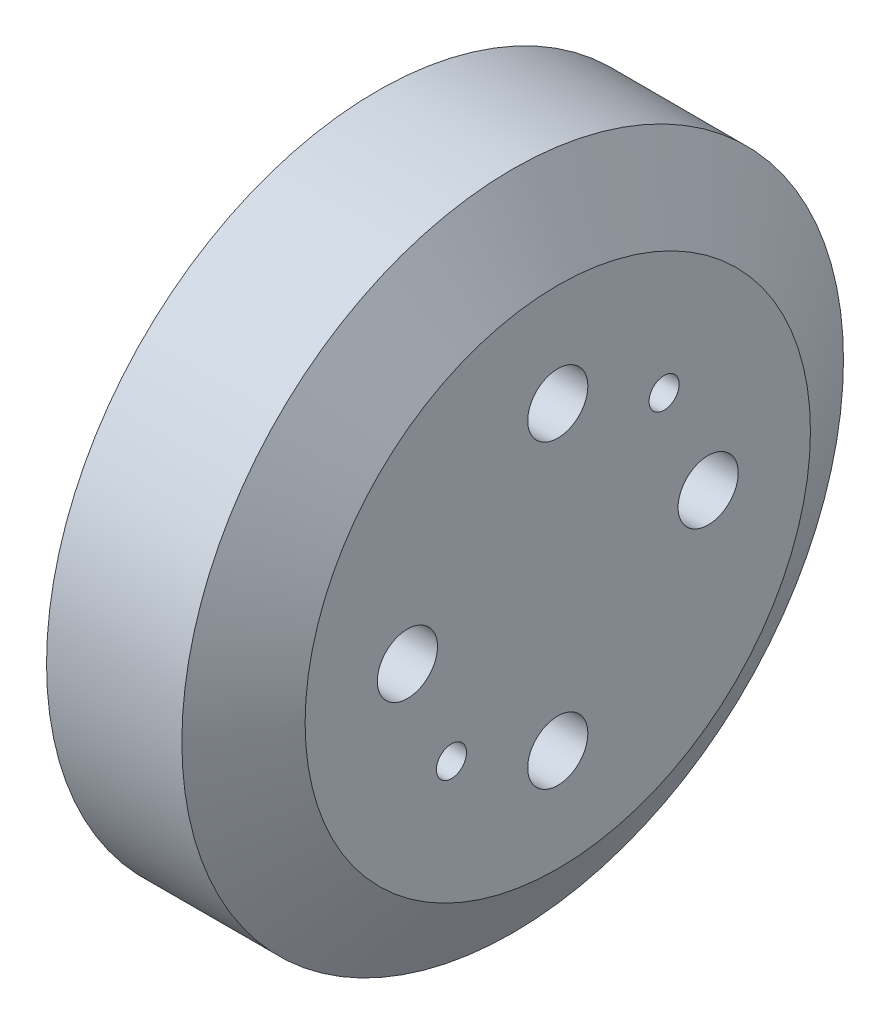
ISO-10303-21;
HEADER;
FILE_DESCRIPTION(('STEP AP214'),'2;1');
FILE_NAME('part.step','',(''),(''),'','','');
FILE_SCHEMA(('AUTOMOTIVE_DESIGN { 1 0 10303 214 1 1 1 1 }'));
ENDSEC;
DATA;
#1=APPLICATION_CONTEXT('core data for automotive mechanical design processes');
#2=APPLICATION_PROTOCOL_DEFINITION('international standard','automotive_design',2000,#1);
#3=PRODUCT_CONTEXT('',#1,'mechanical');
#4=PRODUCT('Part','Part','',(#3));
#5=PRODUCT_RELATED_PRODUCT_CATEGORY('part','',(#4));
#6=PRODUCT_DEFINITION_FORMATION('','',#4);
#7=PRODUCT_DEFINITION_CONTEXT('part definition',#1,'design');
#8=PRODUCT_DEFINITION('design','',#6,#7);
#9=PRODUCT_DEFINITION_SHAPE('','',#8);
#10=(LENGTH_UNIT() NAMED_UNIT(*) SI_UNIT(.MILLI.,.METRE.));
#11=(NAMED_UNIT(*) PLANE_ANGLE_UNIT() SI_UNIT($,.RADIAN.));
#12=(NAMED_UNIT(*) SI_UNIT($,.STERADIAN.) SOLID_ANGLE_UNIT());
#13=UNCERTAINTY_MEASURE_WITH_UNIT(LENGTH_MEASURE(1.E-05),#10,'distance_accuracy_value','');
#14=(GEOMETRIC_REPRESENTATION_CONTEXT(3) GLOBAL_UNCERTAINTY_ASSIGNED_CONTEXT((#13)) GLOBAL_UNIT_ASSIGNED_CONTEXT((#10,
#11,#12)) REPRESENTATION_CONTEXT('',''));
#15=CARTESIAN_POINT('',(0.,0.,0.));
#16=DIRECTION('',(0.,0.,1.));
#17=DIRECTION('',(1.,0.,0.));
#18=AXIS2_PLACEMENT_3D('',#15,#16,#17);
#19=CARTESIAN_POINT('',(0.,0.,0.));
#20=DIRECTION('',(1.,0.,0.));
#21=DIRECTION('',(0.,0.,-1.));
#22=AXIS2_PLACEMENT_3D('',#19,#20,#21);
#23=PLANE('',#22);
#24=CARTESIAN_POINT('',(0.,0.,0.));
#25=DIRECTION('',(1.,0.,0.));
#26=DIRECTION('',(0.,0.,-1.));
#27=AXIS2_PLACEMENT_3D('',#24,#25,#26);
#28=CIRCLE('',#27,110.);
#29=CARTESIAN_POINT('',(0.,0.,110.));
#30=VERTEX_POINT('',#29);
#31=EDGE_CURVE('E48',#30,#30,#28,.T.);
#32=ORIENTED_EDGE('',*,*,#31,.F.);
#33=EDGE_LOOP('',(#32));
#34=FACE_BOUND('',#33,.T.);
#35=CARTESIAN_POINT('',(0.,0.,0.));
#36=DIRECTION('',(1.,0.,0.));
#37=DIRECTION('',(0.,0.,-1.));
#38=AXIS2_PLACEMENT_3D('',#35,#36,#37);
#39=CIRCLE('',#38,100.);
#40=CARTESIAN_POINT('',(0.,0.,100.));
#41=VERTEX_POINT('',#40);
#42=EDGE_CURVE('E53',#41,#41,#39,.T.);
#43=ORIENTED_EDGE('',*,*,#42,.T.);
#44=EDGE_LOOP('',(#43));
#45=FACE_BOUND('',#44,.T.);
#46=ADVANCED_FACE('F37',(#34,#45),#23,.F.);
#47=CARTESIAN_POINT('',(45.,0.,0.));
#48=DIRECTION('',(-1.,0.,0.));
#49=DIRECTION('',(0.,0.,1.));
#50=AXIS2_PLACEMENT_3D('',#47,#48,#49);
#51=CYLINDRICAL_SURFACE('',#50,110.);
#52=CARTESIAN_POINT('',(45.,0.,0.));
#53=DIRECTION('',(1.,0.,0.));
#54=DIRECTION('',(0.,0.,-1.));
#55=AXIS2_PLACEMENT_3D('',#52,#53,#54);
#56=CIRCLE('',#55,110.);
#57=CARTESIAN_POINT('',(45.,0.,110.));
#58=VERTEX_POINT('',#57);
#59=EDGE_CURVE('E44',#58,#58,#56,.T.);
#60=CARTESIAN_POINT('',(45.,0.,110.));
#61=CARTESIAN_POINT('',(44.53125,0.,110.));
#62=CARTESIAN_POINT('',(44.0625,0.,110.));
#63=CARTESIAN_POINT('',(43.125,0.,110.));
#64=CARTESIAN_POINT('',(42.65625,0.,110.));
#65=CARTESIAN_POINT('',(41.71875,0.,110.));
#66=CARTESIAN_POINT('',(41.25,0.,110.));
#67=CARTESIAN_POINT('',(40.3125,0.,110.));
#68=CARTESIAN_POINT('',(39.84375,0.,110.));
#69=CARTESIAN_POINT('',(38.90625,0.,110.));
#70=CARTESIAN_POINT('',(38.4375,0.,110.));
#71=CARTESIAN_POINT('',(37.5,0.,110.));
#72=CARTESIAN_POINT('',(37.03125,0.,110.));
#73=CARTESIAN_POINT('',(36.09375,0.,110.));
#74=CARTESIAN_POINT('',(35.625,0.,110.));
#75=CARTESIAN_POINT('',(34.6875,0.,110.));
#76=CARTESIAN_POINT('',(34.21875,0.,110.));
#77=CARTESIAN_POINT('',(33.28125,0.,110.));
#78=CARTESIAN_POINT('',(32.8125,0.,110.));
#79=CARTESIAN_POINT('',(31.875,0.,110.));
#80=CARTESIAN_POINT('',(31.40625,0.,110.));
#81=CARTESIAN_POINT('',(30.46875,0.,110.));
#82=CARTESIAN_POINT('',(30.,0.,110.));
#83=CARTESIAN_POINT('',(29.0625,0.,110.));
#84=CARTESIAN_POINT('',(28.59375,0.,110.));
#85=CARTESIAN_POINT('',(27.65625,0.,110.));
#86=CARTESIAN_POINT('',(27.1875,0.,110.));
#87=CARTESIAN_POINT('',(26.25,0.,110.));
#88=CARTESIAN_POINT('',(25.78125,0.,110.));
#89=CARTESIAN_POINT('',(24.84375,0.,110.));
#90=CARTESIAN_POINT('',(24.375,0.,110.));
#91=CARTESIAN_POINT('',(23.4375,0.,110.));
#92=CARTESIAN_POINT('',(22.96875,0.,110.));
#93=CARTESIAN_POINT('',(22.03125,0.,110.));
#94=CARTESIAN_POINT('',(21.5625,0.,110.));
#95=CARTESIAN_POINT('',(20.625,0.,110.));
#96=CARTESIAN_POINT('',(20.15625,0.,110.));
#97=CARTESIAN_POINT('',(19.21875,0.,110.));
#98=CARTESIAN_POINT('',(18.75,0.,110.));
#99=CARTESIAN_POINT('',(17.8125,0.,110.));
#100=CARTESIAN_POINT('',(17.34375,0.,110.));
#101=CARTESIAN_POINT('',(16.40625,0.,110.));
#102=CARTESIAN_POINT('',(15.9375,0.,110.));
#103=CARTESIAN_POINT('',(15.,0.,110.));
#104=CARTESIAN_POINT('',(14.53125,0.,110.));
#105=CARTESIAN_POINT('',(13.59375,0.,110.));
#106=CARTESIAN_POINT('',(13.125,0.,110.));
#107=CARTESIAN_POINT('',(12.1875,0.,110.));
#108=CARTESIAN_POINT('',(11.71875,0.,110.));
#109=CARTESIAN_POINT('',(10.78125,0.,110.));
#110=CARTESIAN_POINT('',(10.3125,0.,110.));
#111=CARTESIAN_POINT('',(9.375,0.,110.));
#112=CARTESIAN_POINT('',(8.90625,0.,110.));
#113=CARTESIAN_POINT('',(7.96874999999999,0.,110.));
#114=CARTESIAN_POINT('',(7.5,0.,110.));
#115=CARTESIAN_POINT('',(6.5625,0.,110.));
#116=CARTESIAN_POINT('',(6.09375,0.,110.));
#117=CARTESIAN_POINT('',(5.15625,0.,110.));
#118=CARTESIAN_POINT('',(4.68749999999999,0.,110.));
#119=CARTESIAN_POINT('',(3.74999999999999,0.,110.));
#120=CARTESIAN_POINT('',(3.28124999999999,0.,110.));
#121=CARTESIAN_POINT('',(2.34374999999999,0.,110.));
#122=CARTESIAN_POINT('',(1.87499999999999,0.,110.));
#123=CARTESIAN_POINT('',(0.937499999999992,0.,110.));
#124=CARTESIAN_POINT('',(0.468749999999993,0.,110.));
#125=CARTESIAN_POINT('',(0.,0.,110.));
#126=B_SPLINE_CURVE_WITH_KNOTS('',3,(#60,#61,#62,#63,#64,#65,#66,#67,#68,#69,#70,#71,#72,#73,
#74,#75,#76,#77,#78,#79,#80,#81,#82,#83,#84,#85,#86,#87,#88,#89,#90,#91,#92,#93,#94,#95,#96,#97,
#98,#99,#100,#101,#102,#103,#104,#105,#106,#107,#108,#109,#110,#111,#112,#113,#114,#115,#116,
#117,#118,#119,#120,#121,#122,#123,#124,#125),.UNSPECIFIED.,.F.,.F.,(4,2,2,2,2,2,2,2,2,2,2,2,2,
2,2,2,2,2,2,2,2,2,2,2,2,2,2,2,2,2,2,2,4),(0.,1.40625,2.8125,4.21875000000001,5.62500000000001,
7.03125,8.4375,9.84375000000001,11.25,12.65625,14.0625,15.46875,16.875,18.28125,19.6875,
21.09375,22.5,23.90625,25.3125,26.71875,28.125,29.53125,30.9375,32.34375,33.75,35.15625,36.5625,
37.96875,39.375,40.78125,42.1875,43.59375,45.),.UNSPECIFIED.);
#127=EDGE_CURVE('BSEAM39',#58,#30,#126,.T.);
#128=ORIENTED_EDGE('',*,*,#59,.F.);
#129=ORIENTED_EDGE('',*,*,#31,.T.);
#130=ORIENTED_EDGE('',*,*,#127,.T.);
#131=ORIENTED_EDGE('',*,*,#127,.F.);
#132=EDGE_LOOP('',(#128,#130,#129,#131));
#133=FACE_BOUND('',#132,.T.);
#134=ADVANCED_FACE('F39',(#133),#51,.T.);
#135=CARTESIAN_POINT('',(45.,0.,0.));
#136=DIRECTION('',(-1.,0.,0.));
#137=DIRECTION('',(0.,0.,1.));
#138=AXIS2_PLACEMENT_3D('',#135,#136,#137);
#139=CYLINDRICAL_SURFACE('',#138,100.);
#140=CARTESIAN_POINT('',(45.,0.,0.));
#141=DIRECTION('',(1.,0.,0.));
#142=DIRECTION('',(0.,0.,-1.));
#143=AXIS2_PLACEMENT_3D('',#140,#141,#142);
#144=CIRCLE('',#143,100.);
#145=CARTESIAN_POINT('',(45.,0.,100.));
#146=VERTEX_POINT('',#145);
#147=EDGE_CURVE('E57',#146,#146,#144,.T.);
#148=CARTESIAN_POINT('',(45.,0.,100.));
#149=CARTESIAN_POINT('',(44.53125,0.,100.));
#150=CARTESIAN_POINT('',(44.0625,0.,100.));
#151=CARTESIAN_POINT('',(43.125,0.,100.));
#152=CARTESIAN_POINT('',(42.65625,0.,100.));
#153=CARTESIAN_POINT('',(41.71875,0.,100.));
#154=CARTESIAN_POINT('',(41.25,0.,100.));
#155=CARTESIAN_POINT('',(40.3125,0.,100.));
#156=CARTESIAN_POINT('',(39.84375,0.,100.));
#157=CARTESIAN_POINT('',(38.90625,0.,100.));
#158=CARTESIAN_POINT('',(38.4375,0.,100.));
#159=CARTESIAN_POINT('',(37.5,0.,100.));
#160=CARTESIAN_POINT('',(37.03125,0.,100.));
#161=CARTESIAN_POINT('',(36.09375,0.,100.));
#162=CARTESIAN_POINT('',(35.625,0.,100.));
#163=CARTESIAN_POINT('',(34.6875,0.,100.));
#164=CARTESIAN_POINT('',(34.21875,0.,100.));
#165=CARTESIAN_POINT('',(33.28125,0.,100.));
#166=CARTESIAN_POINT('',(32.8125,0.,100.));
#167=CARTESIAN_POINT('',(31.875,0.,100.));
#168=CARTESIAN_POINT('',(31.40625,0.,100.));
#169=CARTESIAN_POINT('',(30.46875,0.,100.));
#170=CARTESIAN_POINT('',(30.,0.,100.));
#171=CARTESIAN_POINT('',(29.0625,0.,100.));
#172=CARTESIAN_POINT('',(28.59375,0.,100.));
#173=CARTESIAN_POINT('',(27.65625,0.,100.));
#174=CARTESIAN_POINT('',(27.1875,0.,100.));
#175=CARTESIAN_POINT('',(26.25,0.,100.));
#176=CARTESIAN_POINT('',(25.78125,0.,100.));
#177=CARTESIAN_POINT('',(24.84375,0.,100.));
#178=CARTESIAN_POINT('',(24.375,0.,100.));
#179=CARTESIAN_POINT('',(23.4375,0.,100.));
#180=CARTESIAN_POINT('',(22.96875,0.,100.));
#181=CARTESIAN_POINT('',(22.03125,0.,100.));
#182=CARTESIAN_POINT('',(21.5625,0.,100.));
#183=CARTESIAN_POINT('',(20.625,0.,100.));
#184=CARTESIAN_POINT('',(20.15625,0.,100.));
#185=CARTESIAN_POINT('',(19.21875,0.,100.));
#186=CARTESIAN_POINT('',(18.75,0.,100.));
#187=CARTESIAN_POINT('',(17.8125,0.,100.));
#188=CARTESIAN_POINT('',(17.34375,0.,100.));
#189=CARTESIAN_POINT('',(16.40625,0.,100.));
#190=CARTESIAN_POINT('',(15.9375,0.,100.));
#191=CARTESIAN_POINT('',(15.,0.,100.));
#192=CARTESIAN_POINT('',(14.53125,0.,100.));
#193=CARTESIAN_POINT('',(13.59375,0.,100.));
#194=CARTESIAN_POINT('',(13.125,0.,100.));
#195=CARTESIAN_POINT('',(12.1875,0.,100.));
#196=CARTESIAN_POINT('',(11.71875,0.,100.));
#197=CARTESIAN_POINT('',(10.78125,0.,100.));
#198=CARTESIAN_POINT('',(10.3125,0.,100.));
#199=CARTESIAN_POINT('',(9.375,0.,100.));
#200=CARTESIAN_POINT('',(8.90625,0.,100.));
#201=CARTESIAN_POINT('',(7.96874999999999,0.,100.));
#202=CARTESIAN_POINT('',(7.5,0.,100.));
#203=CARTESIAN_POINT('',(6.5625,0.,100.));
#204=CARTESIAN_POINT('',(6.09375,0.,100.));
#205=CARTESIAN_POINT('',(5.15625,0.,100.));
#206=CARTESIAN_POINT('',(4.68749999999999,0.,100.));
#207=CARTESIAN_POINT('',(3.74999999999999,0.,100.));
#208=CARTESIAN_POINT('',(3.28124999999999,0.,100.));
#209=CARTESIAN_POINT('',(2.34374999999999,0.,100.));
#210=CARTESIAN_POINT('',(1.87499999999999,0.,100.));
#211=CARTESIAN_POINT('',(0.937499999999992,0.,100.));
#212=CARTESIAN_POINT('',(0.468749999999993,0.,100.));
#213=CARTESIAN_POINT('',(0.,0.,100.));
#214=B_SPLINE_CURVE_WITH_KNOTS('',3,(#148,#149,#150,#151,#152,#153,#154,#155,#156,#157,#158,
#159,#160,#161,#162,#163,#164,#165,#166,#167,#168,#169,#170,#171,#172,#173,#174,#175,#176,#177,
#178,#179,#180,#181,#182,#183,#184,#185,#186,#187,#188,#189,#190,#191,#192,#193,#194,#195,#196,
#197,#198,#199,#200,#201,#202,#203,#204,#205,#206,#207,#208,#209,#210,#211,#212,#213),
.UNSPECIFIED.,.F.,.F.,(4,2,2,2,2,2,2,2,2,2,2,2,2,2,2,2,2,2,2,2,2,2,2,2,2,2,2,2,2,2,2,2,4),(0.,
1.40625,2.8125,4.21875000000001,5.62500000000001,7.03125,8.4375,9.84375000000001,11.25,12.65625,
14.0625,15.46875,16.875,18.28125,19.6875,21.09375,22.5,23.90625,25.3125,26.71875,28.125,
29.53125,30.9375,32.34375,33.75,35.15625,36.5625,37.96875,39.375,40.78125,42.1875,43.59375,45.),.UNSPECIFIED.);
#215=EDGE_CURVE('BSEAM125',#146,#41,#214,.T.);
#216=ORIENTED_EDGE('',*,*,#147,.T.);
#217=ORIENTED_EDGE('',*,*,#42,.F.);
#218=ORIENTED_EDGE('',*,*,#215,.T.);
#219=ORIENTED_EDGE('',*,*,#215,.F.);
#220=EDGE_LOOP('',(#216,#218,#217,#219));
#221=FACE_BOUND('',#220,.T.);
#222=ADVANCED_FACE('F125',(#221),#139,.F.);
#223=CARTESIAN_POINT('',(45.,0.,0.));
#224=DIRECTION('',(1.,0.,0.));
#225=DIRECTION('',(0.,0.,-1.));
#226=AXIS2_PLACEMENT_3D('',#223,#224,#225);
#227=PLANE('',#226);
#228=CARTESIAN_POINT('',(45.,35.3553390593277,-35.3553390593271));
#229=DIRECTION('',(1.,0.,0.));
#230=DIRECTION('',(0.,0.,-1.));
#231=AXIS2_PLACEMENT_3D('',#228,#229,#230);
#232=CIRCLE('',#231,5.);
#233=CARTESIAN_POINT('',(45.,35.3553390593277,-40.3553390593271));
#234=VERTEX_POINT('',#233);
#235=EDGE_CURVE('E66',#234,#234,#232,.T.);
#236=ORIENTED_EDGE('',*,*,#235,.T.);
#237=EDGE_LOOP('',(#236));
#238=FACE_BOUND('',#237,.T.);
#239=CARTESIAN_POINT('',(45.,1.4119006205266E-12,-50.0000000000014));
#240=DIRECTION('',(1.,0.,0.));
#241=DIRECTION('',(0.,0.,-1.));
#242=AXIS2_PLACEMENT_3D('',#239,#240,#241);
#243=CIRCLE('',#242,10.);
#244=CARTESIAN_POINT('',(45.,1.4119006205266E-12,-60.0000000000014));
#245=VERTEX_POINT('',#244);
#246=EDGE_CURVE('E69',#245,#245,#243,.T.);
#247=ORIENTED_EDGE('',*,*,#246,.T.);
#248=EDGE_LOOP('',(#247));
#249=FACE_BOUND('',#248,.T.);
#250=CARTESIAN_POINT('',(45.,-50.,-2.82380124105319E-12));
#251=DIRECTION('',(1.,0.,0.));
#252=DIRECTION('',(0.,0.,-1.));
#253=AXIS2_PLACEMENT_3D('',#250,#251,#252);
#254=CIRCLE('',#253,10.);
#255=CARTESIAN_POINT('',(45.,-50.,-10.0000000000028));
#256=VERTEX_POINT('',#255);
#257=EDGE_CURVE('E72',#256,#256,#254,.T.);
#258=ORIENTED_EDGE('',*,*,#257,.T.);
#259=EDGE_LOOP('',(#258));
#260=FACE_BOUND('',#259,.T.);
#261=CARTESIAN_POINT('',(45.,-1.41802385452233E-12,49.9999999999986));
#262=DIRECTION('',(1.,0.,0.));
#263=DIRECTION('',(0.,0.,-1.));
#264=AXIS2_PLACEMENT_3D('',#261,#262,#263);
#265=CIRCLE('',#264,10.);
#266=CARTESIAN_POINT('',(45.,-1.41802385452233E-12,39.9999999999986));
#267=VERTEX_POINT('',#266);
#268=EDGE_CURVE('E75',#267,#267,#265,.T.);
#269=ORIENTED_EDGE('',*,*,#268,.T.);
#270=EDGE_LOOP('',(#269));
#271=FACE_BOUND('',#270,.T.);
#272=CARTESIAN_POINT('',(45.,-35.3553390593274,35.3553390593273));
#273=DIRECTION('',(1.,0.,0.));
#274=DIRECTION('',(0.,0.,-1.));
#275=AXIS2_PLACEMENT_3D('',#272,#273,#274);
#276=CIRCLE('',#275,4.99999999999999);
#277=CARTESIAN_POINT('',(45.,-35.3553390593274,30.3553390593273));
#278=VERTEX_POINT('',#277);
#279=EDGE_CURVE('E78',#278,#278,#276,.T.);
#280=ORIENTED_EDGE('',*,*,#279,.T.);
#281=EDGE_LOOP('',(#280));
#282=FACE_BOUND('',#281,.T.);
#283=CARTESIAN_POINT('',(45.,50.,0.));
#284=DIRECTION('',(1.,0.,0.));
#285=DIRECTION('',(0.,0.,-1.));
#286=AXIS2_PLACEMENT_3D('',#283,#284,#285);
#287=CIRCLE('',#286,10.);
#288=CARTESIAN_POINT('',(45.,50.,-10.));
#289=VERTEX_POINT('',#288);
#290=EDGE_CURVE('E81',#289,#289,#287,.T.);
#291=ORIENTED_EDGE('',*,*,#290,.T.);
#292=EDGE_LOOP('',(#291));
#293=FACE_BOUND('',#292,.T.);
#294=CARTESIAN_POINT('',(45.,0.,0.));
#295=DIRECTION('',(1.,0.,0.));
#296=DIRECTION('',(0.,0.,-1.));
#297=AXIS2_PLACEMENT_3D('',#294,#295,#296);
#298=CIRCLE('',#297,30.);
#299=CARTESIAN_POINT('',(45.,0.,-30.));
#300=VERTEX_POINT('',#299);
#301=EDGE_CURVE('E10',#300,#300,#298,.F.);
#302=ORIENTED_EDGE('',*,*,#301,.F.);
#303=EDGE_LOOP('',(#302));
#304=FACE_BOUND('',#303,.T.);
#305=ORIENTED_EDGE('',*,*,#147,.F.);
#306=EDGE_LOOP('',(#305));
#307=FACE_BOUND('',#306,.T.);
#308=ADVANCED_FACE('F118',(#238,#249,#260,#271,#282,#293,#304,#307),#227,.F.);
#309=CARTESIAN_POINT('',(45.,0.,0.));
#310=DIRECTION('',(-1.,0.,0.));
#311=DIRECTION('',(0.,0.,-1.));
#312=AXIS2_PLACEMENT_3D('',#309,#310,#311);
#313=CONICAL_SURFACE('',#312,110.,1.0471975511966);
#314=CARTESIAN_POINT('',(60.,0.,0.));
#315=DIRECTION('',(1.,0.,0.));
#316=DIRECTION('',(0.,0.,-1.));
#317=AXIS2_PLACEMENT_3D('',#314,#315,#316);
#318=CIRCLE('',#317,84.0192378864667);
#319=CARTESIAN_POINT('',(60.,0.,-84.0192378864667));
#320=VERTEX_POINT('',#319);
#321=EDGE_CURVE('E60',#320,#320,#318,.T.);
#322=ORIENTED_EDGE('',*,*,#321,.F.);
#323=EDGE_LOOP('',(#322));
#324=FACE_BOUND('',#323,.T.);
#325=ORIENTED_EDGE('',*,*,#59,.T.);
#326=EDGE_LOOP('',(#325));
#327=FACE_BOUND('',#326,.T.);
#328=ADVANCED_FACE('F110',(#324,#327),#313,.T.);
#329=CARTESIAN_POINT('',(60.,0.,0.));
#330=DIRECTION('',(1.,0.,0.));
#331=DIRECTION('',(0.,0.,-1.));
#332=AXIS2_PLACEMENT_3D('',#329,#330,#331);
#333=PLANE('',#332);
#334=CARTESIAN_POINT('',(60.,35.3553390593277,-35.3553390593271));
#335=DIRECTION('',(1.,0.,0.));
#336=DIRECTION('',(0.,0.,-1.));
#337=AXIS2_PLACEMENT_3D('',#334,#335,#336);
#338=CIRCLE('',#337,5.);
#339=CARTESIAN_POINT('',(60.,35.3553390593277,-40.3553390593271));
#340=VERTEX_POINT('',#339);
#341=EDGE_CURVE('E87',#340,#340,#338,.T.);
#342=ORIENTED_EDGE('',*,*,#341,.F.);
#343=EDGE_LOOP('',(#342));
#344=FACE_BOUND('',#343,.T.);
#345=CARTESIAN_POINT('',(60.,1.4119006205266E-12,-50.0000000000014));
#346=DIRECTION('',(1.,0.,0.));
#347=DIRECTION('',(0.,0.,-1.));
#348=AXIS2_PLACEMENT_3D('',#345,#346,#347);
#349=CIRCLE('',#348,10.);
#350=CARTESIAN_POINT('',(60.,1.4119006205266E-12,-60.0000000000014));
#351=VERTEX_POINT('',#350);
#352=EDGE_CURVE('E95',#351,#351,#349,.T.);
#353=ORIENTED_EDGE('',*,*,#352,.F.);
#354=EDGE_LOOP('',(#353));
#355=FACE_BOUND('',#354,.T.);
#356=CARTESIAN_POINT('',(60.,-50.,-2.82380124105319E-12));
#357=DIRECTION('',(1.,0.,0.));
#358=DIRECTION('',(0.,0.,-1.));
#359=AXIS2_PLACEMENT_3D('',#356,#357,#358);
#360=CIRCLE('',#359,10.);
#361=CARTESIAN_POINT('',(60.,-50.,-10.0000000000028));
#362=VERTEX_POINT('',#361);
#363=EDGE_CURVE('E91',#362,#362,#360,.T.);
#364=ORIENTED_EDGE('',*,*,#363,.F.);
#365=EDGE_LOOP('',(#364));
#366=FACE_BOUND('',#365,.T.);
#367=CARTESIAN_POINT('',(60.,-1.41802385452233E-12,49.9999999999986));
#368=DIRECTION('',(1.,0.,0.));
#369=DIRECTION('',(0.,0.,-1.));
#370=AXIS2_PLACEMENT_3D('',#367,#368,#369);
#371=CIRCLE('',#370,10.);
#372=CARTESIAN_POINT('',(60.,-1.41802385452233E-12,39.9999999999986));
#373=VERTEX_POINT('',#372);
#374=EDGE_CURVE('E88',#373,#373,#371,.T.);
#375=ORIENTED_EDGE('',*,*,#374,.F.);
#376=EDGE_LOOP('',(#375));
#377=FACE_BOUND('',#376,.T.);
#378=CARTESIAN_POINT('',(60.,-35.3553390593274,35.3553390593273));
#379=DIRECTION('',(1.,0.,0.));
#380=DIRECTION('',(0.,0.,-1.));
#381=AXIS2_PLACEMENT_3D('',#378,#379,#380);
#382=CIRCLE('',#381,4.99999999999999);
#383=CARTESIAN_POINT('',(60.,-35.3553390593274,30.3553390593273));
#384=VERTEX_POINT('',#383);
#385=EDGE_CURVE('E92',#384,#384,#382,.T.);
#386=ORIENTED_EDGE('',*,*,#385,.F.);
#387=EDGE_LOOP('',(#386));
#388=FACE_BOUND('',#387,.T.);
#389=CARTESIAN_POINT('',(60.,50.,0.));
#390=DIRECTION('',(1.,0.,0.));
#391=DIRECTION('',(0.,0.,-1.));
#392=AXIS2_PLACEMENT_3D('',#389,#390,#391);
#393=CIRCLE('',#392,10.);
#394=CARTESIAN_POINT('',(60.,50.,-10.));
#395=VERTEX_POINT('',#394);
#396=EDGE_CURVE('E84',#395,#395,#393,.T.);
#397=ORIENTED_EDGE('',*,*,#396,.F.);
#398=EDGE_LOOP('',(#397));
#399=FACE_BOUND('',#398,.T.);
#400=ORIENTED_EDGE('',*,*,#321,.T.);
#401=EDGE_LOOP('',(#400));
#402=FACE_BOUND('',#401,.T.);
#403=ADVANCED_FACE('F106',(#344,#355,#366,#377,#388,#399,#402),#333,.T.);
#404=CARTESIAN_POINT('',(-55.,0.,0.));
#405=DIRECTION('',(1.,0.,0.));
#406=DIRECTION('',(0.,0.,-1.));
#407=AXIS2_PLACEMENT_3D('',#404,#405,#406);
#408=CYLINDRICAL_SURFACE('',#407,30.);
#409=CARTESIAN_POINT('',(-55.,0.,0.));
#410=DIRECTION('',(-1.,0.,0.));
#411=DIRECTION('',(0.,0.,1.));
#412=AXIS2_PLACEMENT_3D('',#409,#410,#411);
#413=CIRCLE('',#412,30.);
#414=CARTESIAN_POINT('',(-55.,0.,30.));
#415=VERTEX_POINT('',#414);
#416=EDGE_CURVE('E63',#415,#415,#413,.T.);
#417=ORIENTED_EDGE('',*,*,#416,.F.);
#418=EDGE_LOOP('',(#417));
#419=FACE_BOUND('',#418,.T.);
#420=ORIENTED_EDGE('',*,*,#301,.T.);
#421=EDGE_LOOP('',(#420));
#422=FACE_BOUND('',#421,.T.);
#423=ADVANCED_FACE('F109',(#419,#422),#408,.T.);
#424=CARTESIAN_POINT('',(-55.,0.,0.));
#425=DIRECTION('',(-1.,0.,0.));
#426=DIRECTION('',(0.,0.,1.));
#427=AXIS2_PLACEMENT_3D('',#424,#425,#426);
#428=PLANE('',#427);
#429=ORIENTED_EDGE('',*,*,#416,.T.);
#430=EDGE_LOOP('',(#429));
#431=FACE_BOUND('',#430,.T.);
#432=ADVANCED_FACE('F168',(#431),#428,.T.);
#433=CARTESIAN_POINT('',(-40.,50.,0.));
#434=DIRECTION('',(1.,0.,0.));
#435=DIRECTION('',(0.,0.,-1.));
#436=AXIS2_PLACEMENT_3D('',#433,#434,#435);
#437=CYLINDRICAL_SURFACE('',#436,10.);
#438=ORIENTED_EDGE('',*,*,#396,.T.);
#439=EDGE_LOOP('',(#438));
#440=FACE_BOUND('',#439,.T.);
#441=ORIENTED_EDGE('',*,*,#290,.F.);
#442=EDGE_LOOP('',(#441));
#443=FACE_BOUND('',#442,.T.);
#444=ADVANCED_FACE('F175',(#440,#443),#437,.F.);
#445=CARTESIAN_POINT('',(-40.,-35.3553390593274,35.3553390593273));
#446=DIRECTION('',(1.,0.,0.));
#447=DIRECTION('',(0.,0.,-1.));
#448=AXIS2_PLACEMENT_3D('',#445,#446,#447);
#449=CYLINDRICAL_SURFACE('',#448,4.99999999999999);
#450=ORIENTED_EDGE('',*,*,#385,.T.);
#451=EDGE_LOOP('',(#450));
#452=FACE_BOUND('',#451,.T.);
#453=ORIENTED_EDGE('',*,*,#279,.F.);
#454=EDGE_LOOP('',(#453));
#455=FACE_BOUND('',#454,.T.);
#456=ADVANCED_FACE('F103',(#452,#455),#449,.F.);
#457=CARTESIAN_POINT('',(-40.,-1.41802385452233E-12,49.9999999999986));
#458=DIRECTION('',(1.,0.,0.));
#459=DIRECTION('',(0.,0.,-1.));
#460=AXIS2_PLACEMENT_3D('',#457,#458,#459);
#461=CYLINDRICAL_SURFACE('',#460,10.);
#462=ORIENTED_EDGE('',*,*,#374,.T.);
#463=EDGE_LOOP('',(#462));
#464=FACE_BOUND('',#463,.T.);
#465=ORIENTED_EDGE('',*,*,#268,.F.);
#466=EDGE_LOOP('',(#465));
#467=FACE_BOUND('',#466,.T.);
#468=ADVANCED_FACE('F189',(#464,#467),#461,.F.);
#469=CARTESIAN_POINT('',(-40.,-50.,-2.82380124105319E-12));
#470=DIRECTION('',(1.,0.,0.));
#471=DIRECTION('',(0.,0.,-1.));
#472=AXIS2_PLACEMENT_3D('',#469,#470,#471);
#473=CYLINDRICAL_SURFACE('',#472,10.);
#474=ORIENTED_EDGE('',*,*,#363,.T.);
#475=EDGE_LOOP('',(#474));
#476=FACE_BOUND('',#475,.T.);
#477=ORIENTED_EDGE('',*,*,#257,.F.);
#478=EDGE_LOOP('',(#477));
#479=FACE_BOUND('',#478,.T.);
#480=ADVANCED_FACE('F196',(#476,#479),#473,.F.);
#481=CARTESIAN_POINT('',(-40.,1.4119006205266E-12,-50.0000000000014));
#482=DIRECTION('',(1.,0.,0.));
#483=DIRECTION('',(0.,0.,-1.));
#484=AXIS2_PLACEMENT_3D('',#481,#482,#483);
#485=CYLINDRICAL_SURFACE('',#484,10.);
#486=ORIENTED_EDGE('',*,*,#352,.T.);
#487=EDGE_LOOP('',(#486));
#488=FACE_BOUND('',#487,.T.);
#489=ORIENTED_EDGE('',*,*,#246,.F.);
#490=EDGE_LOOP('',(#489));
#491=FACE_BOUND('',#490,.T.);
#492=ADVANCED_FACE('F204',(#488,#491),#485,.F.);
#493=CARTESIAN_POINT('',(-40.,35.3553390593277,-35.3553390593271));
#494=DIRECTION('',(1.,0.,0.));
#495=DIRECTION('',(0.,0.,-1.));
#496=AXIS2_PLACEMENT_3D('',#493,#494,#495);
#497=CYLINDRICAL_SURFACE('',#496,5.);
#498=ORIENTED_EDGE('',*,*,#341,.T.);
#499=EDGE_LOOP('',(#498));
#500=FACE_BOUND('',#499,.T.);
#501=ORIENTED_EDGE('',*,*,#235,.F.);
#502=EDGE_LOOP('',(#501));
#503=FACE_BOUND('',#502,.T.);
#504=ADVANCED_FACE('F212',(#500,#503),#497,.F.);
#505=CLOSED_SHELL('',(#46,#134,#222,#308,#328,#403,#423,#432,#444,#456,#468,#480,#492,#504));
#506=MANIFOLD_SOLID_BREP('B2',#505);
#507=ADVANCED_BREP_SHAPE_REPRESENTATION('',(#18,#506),#14);
#508=SHAPE_DEFINITION_REPRESENTATION(#9,#507);
ENDSEC;
END-ISO-10303-21;
